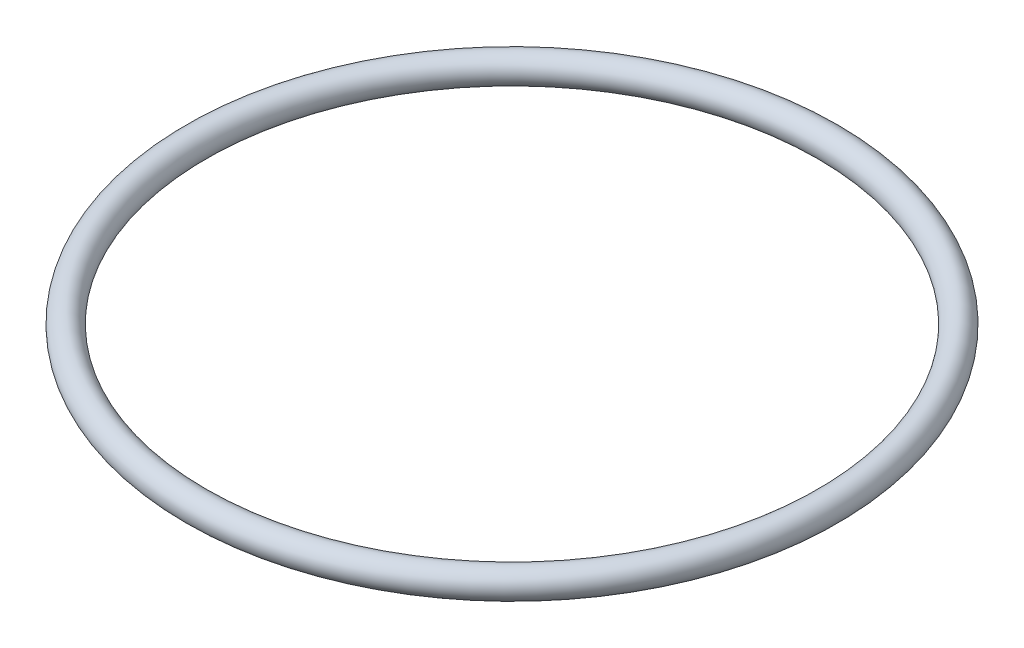
ISO-10303-21;
HEADER;
FILE_DESCRIPTION(('STEP AP214'),'2;1');
FILE_NAME('part.step','',(''),(''),'','','');
FILE_SCHEMA(('AUTOMOTIVE_DESIGN { 1 0 10303 214 1 1 1 1 }'));
ENDSEC;
DATA;
#1=APPLICATION_CONTEXT('core data for automotive mechanical design processes');
#2=APPLICATION_PROTOCOL_DEFINITION('international standard','automotive_design',2000,#1);
#3=PRODUCT_CONTEXT('',#1,'mechanical');
#4=PRODUCT('Part','Part','',(#3));
#5=PRODUCT_RELATED_PRODUCT_CATEGORY('part','',(#4));
#6=PRODUCT_DEFINITION_FORMATION('','',#4);
#7=PRODUCT_DEFINITION_CONTEXT('part definition',#1,'design');
#8=PRODUCT_DEFINITION('design','',#6,#7);
#9=PRODUCT_DEFINITION_SHAPE('','',#8);
#10=(LENGTH_UNIT() NAMED_UNIT(*) SI_UNIT(.MILLI.,.METRE.));
#11=(NAMED_UNIT(*) PLANE_ANGLE_UNIT() SI_UNIT($,.RADIAN.));
#12=(NAMED_UNIT(*) SI_UNIT($,.STERADIAN.) SOLID_ANGLE_UNIT());
#13=UNCERTAINTY_MEASURE_WITH_UNIT(LENGTH_MEASURE(1.E-05),#10,'distance_accuracy_value','');
#14=(GEOMETRIC_REPRESENTATION_CONTEXT(3) GLOBAL_UNCERTAINTY_ASSIGNED_CONTEXT((#13)) GLOBAL_UNIT_ASSIGNED_CONTEXT((#10,
#11,#12)) REPRESENTATION_CONTEXT('',''));
#15=CARTESIAN_POINT('',(0.,0.,0.));
#16=DIRECTION('',(0.,0.,1.));
#17=DIRECTION('',(1.,0.,0.));
#18=AXIS2_PLACEMENT_3D('',#15,#16,#17);
#19=CARTESIAN_POINT('',(0.,0.,29.72));
#20=DIRECTION('',(0.,1.,0.));
#21=DIRECTION('',(0.,0.,1.));
#22=AXIS2_PLACEMENT_3D('',#19,#20,#21);
#23=TOROIDAL_SURFACE('',#22,29.72,1.31);
#24=CARTESIAN_POINT('',(0.,0.,60.75));
#25=VERTEX_POINT('',#24);
#26=VERTEX_LOOP('',#25);
#27=FACE_BOUND('',#26,.T.);
#28=ADVANCED_FACE('F29',(#27),#23,.T.);
#29=CLOSED_SHELL('',(#28));
#30=MANIFOLD_SOLID_BREP('B2',#29);
#31=ADVANCED_BREP_SHAPE_REPRESENTATION('',(#18,#30),#14);
#32=SHAPE_DEFINITION_REPRESENTATION(#9,#31);
ENDSEC;
END-ISO-10303-21;
